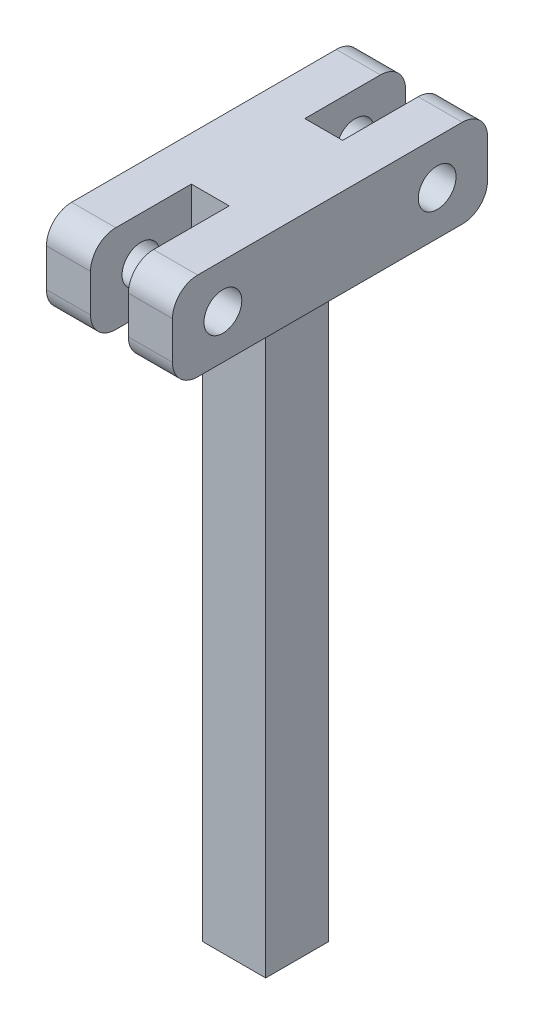
ISO-10303-21;
HEADER;
FILE_DESCRIPTION(('STEP AP214'),'2;1');
FILE_NAME('part.step','',(''),(''),'','','');
FILE_SCHEMA(('AUTOMOTIVE_DESIGN { 1 0 10303 214 1 1 1 1 }'));
ENDSEC;
DATA;
#1=APPLICATION_CONTEXT('core data for automotive mechanical design processes');
#2=APPLICATION_PROTOCOL_DEFINITION('international standard','automotive_design',2000,#1);
#3=PRODUCT_CONTEXT('',#1,'mechanical');
#4=PRODUCT('Part','Part','',(#3));
#5=PRODUCT_RELATED_PRODUCT_CATEGORY('part','',(#4));
#6=PRODUCT_DEFINITION_FORMATION('','',#4);
#7=PRODUCT_DEFINITION_CONTEXT('part definition',#1,'design');
#8=PRODUCT_DEFINITION('design','',#6,#7);
#9=PRODUCT_DEFINITION_SHAPE('','',#8);
#10=(LENGTH_UNIT() NAMED_UNIT(*) SI_UNIT(.MILLI.,.METRE.));
#11=(NAMED_UNIT(*) PLANE_ANGLE_UNIT() SI_UNIT($,.RADIAN.));
#12=(NAMED_UNIT(*) SI_UNIT($,.STERADIAN.) SOLID_ANGLE_UNIT());
#13=UNCERTAINTY_MEASURE_WITH_UNIT(LENGTH_MEASURE(1.E-05),#10,'distance_accuracy_value','');
#14=(GEOMETRIC_REPRESENTATION_CONTEXT(3) GLOBAL_UNCERTAINTY_ASSIGNED_CONTEXT((#13)) GLOBAL_UNIT_ASSIGNED_CONTEXT((#10,
#11,#12)) REPRESENTATION_CONTEXT('',''));
#15=CARTESIAN_POINT('',(0.,0.,0.));
#16=DIRECTION('',(0.,0.,1.));
#17=DIRECTION('',(1.,0.,0.));
#18=AXIS2_PLACEMENT_3D('',#15,#16,#17);
#19=CARTESIAN_POINT('',(5.,1.5,10.5));
#20=DIRECTION('',(-1.,0.,0.));
#21=DIRECTION('',(0.,0.,1.));
#22=AXIS2_PLACEMENT_3D('',#19,#20,#21);
#23=CYLINDRICAL_SURFACE('',#22,2.);
#24=DIRECTION('',(-1.,0.,0.));
#25=VECTOR('',#24,1.);
#26=CARTESIAN_POINT('',(5.,3.5,10.5));
#27=LINE('',#26,#25);
#28=CARTESIAN_POINT('',(5.,3.5,10.5));
#29=VERTEX_POINT('',#28);
#30=CARTESIAN_POINT('',(1.5,3.5,10.5));
#31=VERTEX_POINT('',#30);
#32=EDGE_CURVE('E364',#29,#31,#27,.T.);
#33=ORIENTED_EDGE('',*,*,#32,.T.);
#34=CARTESIAN_POINT('',(1.5,1.5,10.5));
#35=DIRECTION('',(1.,0.,0.));
#36=DIRECTION('',(0.,0.,-1.));
#37=AXIS2_PLACEMENT_3D('',#34,#35,#36);
#38=CIRCLE('',#37,2.);
#39=CARTESIAN_POINT('',(1.5,1.49999999999998,12.5));
#40=VERTEX_POINT('',#39);
#41=EDGE_CURVE('E277',#31,#40,#38,.T.);
#42=ORIENTED_EDGE('',*,*,#41,.T.);
#43=DIRECTION('',(-1.,0.,0.));
#44=VECTOR('',#43,1.);
#45=CARTESIAN_POINT('',(5.,1.5,12.5));
#46=LINE('',#45,#44);
#47=CARTESIAN_POINT('',(5.,1.5,12.5));
#48=VERTEX_POINT('',#47);
#49=EDGE_CURVE('E398',#48,#40,#46,.T.);
#50=ORIENTED_EDGE('',*,*,#49,.F.);
#51=CARTESIAN_POINT('',(5.,1.5,10.5));
#52=DIRECTION('',(1.,0.,0.));
#53=DIRECTION('',(0.,0.,1.));
#54=AXIS2_PLACEMENT_3D('',#51,#52,#53);
#55=CIRCLE('',#54,2.);
#56=EDGE_CURVE('E308',#29,#48,#55,.T.);
#57=ORIENTED_EDGE('',*,*,#56,.F.);
#58=EDGE_LOOP('',(#33,#42,#50,#57));
#59=FACE_BOUND('',#58,.T.);
#60=ADVANCED_FACE('F41',(#59),#23,.T.);
#61=CARTESIAN_POINT('',(5.,-1.5,12.5));
#62=DIRECTION('',(0.,0.,-1.));
#63=DIRECTION('',(-1.,0.,0.));
#64=AXIS2_PLACEMENT_3D('',#61,#62,#63);
#65=PLANE('',#64);
#66=ORIENTED_EDGE('',*,*,#49,.T.);
#67=DIRECTION('',(0.,1.,0.));
#68=VECTOR('',#67,1.);
#69=CARTESIAN_POINT('',(1.5,-50.,12.5));
#70=LINE('',#69,#68);
#71=CARTESIAN_POINT('',(1.5,-1.50000000000002,12.5));
#72=VERTEX_POINT('',#71);
#73=EDGE_CURVE('E477',#72,#40,#70,.T.);
#74=ORIENTED_EDGE('',*,*,#73,.F.);
#75=DIRECTION('',(-1.,0.,0.));
#76=VECTOR('',#75,1.);
#77=CARTESIAN_POINT('',(5.,-1.5,12.5));
#78=LINE('',#77,#76);
#79=CARTESIAN_POINT('',(5.,-1.5,12.5));
#80=VERTEX_POINT('',#79);
#81=EDGE_CURVE('E393',#80,#72,#78,.T.);
#82=ORIENTED_EDGE('',*,*,#81,.F.);
#83=DIRECTION('',(0.,-1.,0.));
#84=VECTOR('',#83,1.);
#85=CARTESIAN_POINT('',(5.,-1.5,12.5));
#86=LINE('',#85,#84);
#87=EDGE_CURVE('E312',#48,#80,#86,.T.);
#88=ORIENTED_EDGE('',*,*,#87,.F.);
#89=EDGE_LOOP('',(#66,#74,#82,#88));
#90=FACE_BOUND('',#89,.T.);
#91=ADVANCED_FACE('F531',(#90),#65,.F.);
#92=CARTESIAN_POINT('',(5.,-1.5,10.5));
#93=DIRECTION('',(-1.,0.,0.));
#94=DIRECTION('',(0.,0.,1.));
#95=AXIS2_PLACEMENT_3D('',#92,#93,#94);
#96=CYLINDRICAL_SURFACE('',#95,2.);
#97=ORIENTED_EDGE('',*,*,#81,.T.);
#98=CARTESIAN_POINT('',(1.5,-1.5,10.5));
#99=DIRECTION('',(1.,0.,0.));
#100=DIRECTION('',(0.,0.,-1.));
#101=AXIS2_PLACEMENT_3D('',#98,#99,#100);
#102=CIRCLE('',#101,2.);
#103=CARTESIAN_POINT('',(1.5,-3.5,10.5));
#104=VERTEX_POINT('',#103);
#105=EDGE_CURVE('E285',#72,#104,#102,.T.);
#106=ORIENTED_EDGE('',*,*,#105,.T.);
#107=DIRECTION('',(-1.,0.,0.));
#108=VECTOR('',#107,1.);
#109=CARTESIAN_POINT('',(5.,-3.5,10.5));
#110=LINE('',#109,#108);
#111=CARTESIAN_POINT('',(5.,-3.5,10.5));
#112=VERTEX_POINT('',#111);
#113=EDGE_CURVE('E388',#112,#104,#110,.T.);
#114=ORIENTED_EDGE('',*,*,#113,.F.);
#115=CARTESIAN_POINT('',(5.,-1.5,10.5));
#116=DIRECTION('',(1.,0.,0.));
#117=DIRECTION('',(0.,0.,-1.));
#118=AXIS2_PLACEMENT_3D('',#115,#116,#117);
#119=CIRCLE('',#118,2.);
#120=EDGE_CURVE('E316',#80,#112,#119,.T.);
#121=ORIENTED_EDGE('',*,*,#120,.F.);
#122=EDGE_LOOP('',(#97,#106,#114,#121));
#123=FACE_BOUND('',#122,.T.);
#124=ADVANCED_FACE('F524',(#123),#96,.T.);
#125=CARTESIAN_POINT('',(5.,-1.5,-10.5));
#126=DIRECTION('',(-1.,0.,0.));
#127=DIRECTION('',(0.,0.,1.));
#128=AXIS2_PLACEMENT_3D('',#125,#126,#127);
#129=CYLINDRICAL_SURFACE('',#128,2.);
#130=DIRECTION('',(-1.,0.,0.));
#131=VECTOR('',#130,1.);
#132=CARTESIAN_POINT('',(5.,-3.5,-10.5));
#133=LINE('',#132,#131);
#134=CARTESIAN_POINT('',(5.,-3.5,-10.5));
#135=VERTEX_POINT('',#134);
#136=CARTESIAN_POINT('',(1.5,-3.5,-10.5));
#137=VERTEX_POINT('',#136);
#138=EDGE_CURVE('E383',#135,#137,#133,.T.);
#139=ORIENTED_EDGE('',*,*,#138,.T.);
#140=CARTESIAN_POINT('',(1.5,-1.5,-10.5));
#141=DIRECTION('',(1.,0.,0.));
#142=DIRECTION('',(0.,0.,-1.));
#143=AXIS2_PLACEMENT_3D('',#140,#141,#142);
#144=CIRCLE('',#143,2.);
#145=CARTESIAN_POINT('',(1.5,-1.50000000000002,-12.5));
#146=VERTEX_POINT('',#145);
#147=EDGE_CURVE('E248',#137,#146,#144,.T.);
#148=ORIENTED_EDGE('',*,*,#147,.T.);
#149=DIRECTION('',(-1.,0.,0.));
#150=VECTOR('',#149,1.);
#151=CARTESIAN_POINT('',(5.,-1.5,-12.5));
#152=LINE('',#151,#150);
#153=CARTESIAN_POINT('',(5.,-1.5,-12.5));
#154=VERTEX_POINT('',#153);
#155=EDGE_CURVE('E379',#154,#146,#152,.T.);
#156=ORIENTED_EDGE('',*,*,#155,.F.);
#157=CARTESIAN_POINT('',(5.,-1.5,-10.5));
#158=DIRECTION('',(1.,0.,0.));
#159=DIRECTION('',(0.,0.,1.));
#160=AXIS2_PLACEMENT_3D('',#157,#158,#159);
#161=CIRCLE('',#160,2.);
#162=EDGE_CURVE('E322',#135,#154,#161,.T.);
#163=ORIENTED_EDGE('',*,*,#162,.F.);
#164=EDGE_LOOP('',(#139,#148,#156,#163));
#165=FACE_BOUND('',#164,.T.);
#166=ADVANCED_FACE('F533',(#165),#129,.T.);
#167=CARTESIAN_POINT('',(5.,-1.5,-12.5));
#168=DIRECTION('',(0.,0.,1.));
#169=DIRECTION('',(1.,0.,0.));
#170=AXIS2_PLACEMENT_3D('',#167,#168,#169);
#171=PLANE('',#170);
#172=ORIENTED_EDGE('',*,*,#155,.T.);
#173=DIRECTION('',(0.,1.,0.));
#174=VECTOR('',#173,1.);
#175=CARTESIAN_POINT('',(1.5,-50.,-12.5));
#176=LINE('',#175,#174);
#177=CARTESIAN_POINT('',(1.5,1.49999999999999,-12.5));
#178=VERTEX_POINT('',#177);
#179=EDGE_CURVE('E583',#146,#178,#176,.T.);
#180=ORIENTED_EDGE('',*,*,#179,.T.);
#181=DIRECTION('',(-1.,0.,0.));
#182=VECTOR('',#181,1.);
#183=CARTESIAN_POINT('',(5.,1.5,-12.5));
#184=LINE('',#183,#182);
#185=CARTESIAN_POINT('',(5.,1.5,-12.5));
#186=VERTEX_POINT('',#185);
#187=EDGE_CURVE('E374',#186,#178,#184,.T.);
#188=ORIENTED_EDGE('',*,*,#187,.F.);
#189=DIRECTION('',(0.,1.,0.));
#190=VECTOR('',#189,1.);
#191=CARTESIAN_POINT('',(5.,-1.5,-12.5));
#192=LINE('',#191,#190);
#193=EDGE_CURVE('E325',#154,#186,#192,.T.);
#194=ORIENTED_EDGE('',*,*,#193,.F.);
#195=EDGE_LOOP('',(#172,#180,#188,#194));
#196=FACE_BOUND('',#195,.T.);
#197=ADVANCED_FACE('F566',(#196),#171,.F.);
#198=CARTESIAN_POINT('',(5.,1.5,-10.5));
#199=DIRECTION('',(-1.,0.,0.));
#200=DIRECTION('',(0.,0.,1.));
#201=AXIS2_PLACEMENT_3D('',#198,#199,#200);
#202=CYLINDRICAL_SURFACE('',#201,2.);
#203=ORIENTED_EDGE('',*,*,#187,.T.);
#204=CARTESIAN_POINT('',(1.5,1.5,-10.5));
#205=DIRECTION('',(1.,0.,0.));
#206=DIRECTION('',(0.,0.,-1.));
#207=AXIS2_PLACEMENT_3D('',#204,#205,#206);
#208=CIRCLE('',#207,2.);
#209=CARTESIAN_POINT('',(1.5,3.5,-10.5));
#210=VERTEX_POINT('',#209);
#211=EDGE_CURVE('E244',#178,#210,#208,.T.);
#212=ORIENTED_EDGE('',*,*,#211,.T.);
#213=DIRECTION('',(-1.,0.,0.));
#214=VECTOR('',#213,1.);
#215=CARTESIAN_POINT('',(5.,3.5,-10.5));
#216=LINE('',#215,#214);
#217=CARTESIAN_POINT('',(5.,3.5,-10.5));
#218=VERTEX_POINT('',#217);
#219=EDGE_CURVE('E369',#218,#210,#216,.T.);
#220=ORIENTED_EDGE('',*,*,#219,.F.);
#221=CARTESIAN_POINT('',(5.,1.5,-10.5));
#222=DIRECTION('',(1.,0.,0.));
#223=DIRECTION('',(0.,0.,1.));
#224=AXIS2_PLACEMENT_3D('',#221,#222,#223);
#225=CIRCLE('',#224,2.);
#226=EDGE_CURVE('E328',#186,#218,#225,.T.);
#227=ORIENTED_EDGE('',*,*,#226,.F.);
#228=EDGE_LOOP('',(#203,#212,#220,#227));
#229=FACE_BOUND('',#228,.T.);
#230=ADVANCED_FACE('F563',(#229),#202,.T.);
#231=CARTESIAN_POINT('',(5.,0.,8.5));
#232=DIRECTION('',(-1.,0.,0.));
#233=DIRECTION('',(0.,0.,1.));
#234=AXIS2_PLACEMENT_3D('',#231,#232,#233);
#235=CYLINDRICAL_SURFACE('',#234,1.5);
#236=CARTESIAN_POINT('',(1.5,0.,8.5));
#237=DIRECTION('',(1.,0.,0.));
#238=DIRECTION('',(0.,0.,-1.));
#239=AXIS2_PLACEMENT_3D('',#236,#237,#238);
#240=CIRCLE('',#239,1.5);
#241=CARTESIAN_POINT('',(1.5,0.,7.));
#242=VERTEX_POINT('',#241);
#243=EDGE_CURVE('E272',#242,#242,#240,.T.);
#244=ORIENTED_EDGE('',*,*,#243,.F.);
#245=EDGE_LOOP('',(#244));
#246=FACE_BOUND('',#245,.T.);
#247=CARTESIAN_POINT('',(5.,0.,8.5));
#248=DIRECTION('',(1.,0.,0.));
#249=DIRECTION('',(0.,0.,-1.));
#250=AXIS2_PLACEMENT_3D('',#247,#248,#249);
#251=CIRCLE('',#250,1.5);
#252=CARTESIAN_POINT('',(5.,0.,7.));
#253=VERTEX_POINT('',#252);
#254=EDGE_CURVE('E300',#253,#253,#251,.T.);
#255=ORIENTED_EDGE('',*,*,#254,.T.);
#256=EDGE_LOOP('',(#255));
#257=FACE_BOUND('',#256,.T.);
#258=ADVANCED_FACE('F607',(#246,#257),#235,.F.);
#259=CARTESIAN_POINT('',(5.,0.,-8.49999999999999));
#260=DIRECTION('',(-1.,0.,0.));
#261=DIRECTION('',(0.,0.,1.));
#262=AXIS2_PLACEMENT_3D('',#259,#260,#261);
#263=CYLINDRICAL_SURFACE('',#262,1.5);
#264=CARTESIAN_POINT('',(1.5,0.,-8.49999999999999));
#265=DIRECTION('',(1.,0.,0.));
#266=DIRECTION('',(0.,0.,-1.));
#267=AXIS2_PLACEMENT_3D('',#264,#265,#266);
#268=CIRCLE('',#267,1.5);
#269=CARTESIAN_POINT('',(1.5,0.,-9.99999999999999));
#270=VERTEX_POINT('',#269);
#271=EDGE_CURVE('E230',#270,#270,#268,.T.);
#272=ORIENTED_EDGE('',*,*,#271,.F.);
#273=EDGE_LOOP('',(#272));
#274=FACE_BOUND('',#273,.T.);
#275=CARTESIAN_POINT('',(5.,0.,-8.49999999999999));
#276=DIRECTION('',(1.,0.,0.));
#277=DIRECTION('',(0.,0.,-1.));
#278=AXIS2_PLACEMENT_3D('',#275,#276,#277);
#279=CIRCLE('',#278,1.5);
#280=CARTESIAN_POINT('',(5.,0.,-9.99999999999999));
#281=VERTEX_POINT('',#280);
#282=EDGE_CURVE('E292',#281,#281,#279,.T.);
#283=ORIENTED_EDGE('',*,*,#282,.T.);
#284=EDGE_LOOP('',(#283));
#285=FACE_BOUND('',#284,.T.);
#286=ADVANCED_FACE('F553',(#274,#285),#263,.F.);
#287=CARTESIAN_POINT('',(5.,1.5,10.5));
#288=DIRECTION('',(-1.,0.,0.));
#289=DIRECTION('',(0.,0.,1.));
#290=AXIS2_PLACEMENT_3D('',#287,#288,#289);
#291=PLANE('',#290);
#292=ORIENTED_EDGE('',*,*,#56,.T.);
#293=ORIENTED_EDGE('',*,*,#87,.T.);
#294=ORIENTED_EDGE('',*,*,#120,.T.);
#295=DIRECTION('',(0.,0.,-1.));
#296=VECTOR('',#295,1.);
#297=CARTESIAN_POINT('',(5.,-3.5,-10.5));
#298=LINE('',#297,#296);
#299=EDGE_CURVE('E319',#112,#135,#298,.T.);
#300=ORIENTED_EDGE('',*,*,#299,.T.);
#301=ORIENTED_EDGE('',*,*,#162,.T.);
#302=ORIENTED_EDGE('',*,*,#193,.T.);
#303=ORIENTED_EDGE('',*,*,#226,.T.);
#304=DIRECTION('',(0.,0.,1.));
#305=VECTOR('',#304,1.);
#306=CARTESIAN_POINT('',(5.,3.5,-10.5));
#307=LINE('',#306,#305);
#308=EDGE_CURVE('E331',#218,#29,#307,.T.);
#309=ORIENTED_EDGE('',*,*,#308,.T.);
#310=EDGE_LOOP('',(#292,#293,#294,#300,#301,#302,#303,#309));
#311=FACE_BOUND('',#310,.T.);
#312=ORIENTED_EDGE('',*,*,#254,.F.);
#313=EDGE_LOOP('',(#312));
#314=FACE_BOUND('',#313,.T.);
#315=ORIENTED_EDGE('',*,*,#282,.F.);
#316=EDGE_LOOP('',(#315));
#317=FACE_BOUND('',#316,.T.);
#318=ADVANCED_FACE('F547',(#311,#314,#317),#291,.F.);
#319=CARTESIAN_POINT('',(-5.,1.5,10.5));
#320=DIRECTION('',(-1.,0.,0.));
#321=DIRECTION('',(0.,0.,1.));
#322=AXIS2_PLACEMENT_3D('',#319,#320,#321);
#323=PLANE('',#322);
#324=CARTESIAN_POINT('',(-5.,0.,8.5));
#325=DIRECTION('',(1.,0.,0.));
#326=DIRECTION('',(0.,0.,-1.));
#327=AXIS2_PLACEMENT_3D('',#324,#325,#326);
#328=CIRCLE('',#327,1.5);
#329=CARTESIAN_POINT('',(-5.,0.,7.));
#330=VERTEX_POINT('',#329);
#331=EDGE_CURVE('E296',#330,#330,#328,.T.);
#332=ORIENTED_EDGE('',*,*,#331,.T.);
#333=EDGE_LOOP('',(#332));
#334=FACE_BOUND('',#333,.T.);
#335=CARTESIAN_POINT('',(-5.,1.5,10.5));
#336=DIRECTION('',(1.,0.,0.));
#337=DIRECTION('',(0.,0.,1.));
#338=AXIS2_PLACEMENT_3D('',#335,#336,#337);
#339=CIRCLE('',#338,2.);
#340=CARTESIAN_POINT('',(-5.,3.5,10.5));
#341=VERTEX_POINT('',#340);
#342=CARTESIAN_POINT('',(-5.,1.5,12.5));
#343=VERTEX_POINT('',#342);
#344=EDGE_CURVE('E304',#341,#343,#339,.T.);
#345=ORIENTED_EDGE('',*,*,#344,.F.);
#346=DIRECTION('',(0.,0.,1.));
#347=VECTOR('',#346,1.);
#348=CARTESIAN_POINT('',(-5.,3.5,-10.5));
#349=LINE('',#348,#347);
#350=CARTESIAN_POINT('',(-5.,3.5,-10.5));
#351=VERTEX_POINT('',#350);
#352=EDGE_CURVE('E313',#351,#341,#349,.T.);
#353=ORIENTED_EDGE('',*,*,#352,.F.);
#354=CARTESIAN_POINT('',(-5.,1.5,-10.5));
#355=DIRECTION('',(1.,0.,0.));
#356=DIRECTION('',(0.,0.,1.));
#357=AXIS2_PLACEMENT_3D('',#354,#355,#356);
#358=CIRCLE('',#357,2.);
#359=CARTESIAN_POINT('',(-5.,1.5,-12.5));
#360=VERTEX_POINT('',#359);
#361=EDGE_CURVE('E357',#360,#351,#358,.T.);
#362=ORIENTED_EDGE('',*,*,#361,.F.);
#363=DIRECTION('',(0.,1.,0.));
#364=VECTOR('',#363,1.);
#365=CARTESIAN_POINT('',(-5.,-1.5,-12.5));
#366=LINE('',#365,#364);
#367=CARTESIAN_POINT('',(-5.,-1.5,-12.5));
#368=VERTEX_POINT('',#367);
#369=EDGE_CURVE('E353',#368,#360,#366,.T.);
#370=ORIENTED_EDGE('',*,*,#369,.F.);
#371=CARTESIAN_POINT('',(-5.,-1.5,-10.5));
#372=DIRECTION('',(1.,0.,0.));
#373=DIRECTION('',(0.,0.,1.));
#374=AXIS2_PLACEMENT_3D('',#371,#372,#373);
#375=CIRCLE('',#374,2.);
#376=CARTESIAN_POINT('',(-5.,-3.5,-10.5));
#377=VERTEX_POINT('',#376);
#378=EDGE_CURVE('E349',#377,#368,#375,.T.);
#379=ORIENTED_EDGE('',*,*,#378,.F.);
#380=DIRECTION('',(0.,0.,-1.));
#381=VECTOR('',#380,1.);
#382=CARTESIAN_POINT('',(-5.,-3.5,-10.5));
#383=LINE('',#382,#381);
#384=CARTESIAN_POINT('',(-5.,-3.5,10.5));
#385=VERTEX_POINT('',#384);
#386=EDGE_CURVE('E346',#385,#377,#383,.T.);
#387=ORIENTED_EDGE('',*,*,#386,.F.);
#388=CARTESIAN_POINT('',(-5.,-1.5,10.5));
#389=DIRECTION('',(1.,0.,0.));
#390=DIRECTION('',(0.,0.,-1.));
#391=AXIS2_PLACEMENT_3D('',#388,#389,#390);
#392=CIRCLE('',#391,2.);
#393=CARTESIAN_POINT('',(-5.,-1.5,12.5));
#394=VERTEX_POINT('',#393);
#395=EDGE_CURVE('E342',#394,#385,#392,.T.);
#396=ORIENTED_EDGE('',*,*,#395,.F.);
#397=DIRECTION('',(0.,-1.,0.));
#398=VECTOR('',#397,1.);
#399=CARTESIAN_POINT('',(-5.,-1.5,12.5));
#400=LINE('',#399,#398);
#401=EDGE_CURVE('E338',#343,#394,#400,.T.);
#402=ORIENTED_EDGE('',*,*,#401,.F.);
#403=EDGE_LOOP('',(#345,#353,#362,#370,#379,#387,#396,#402));
#404=FACE_BOUND('',#403,.T.);
#405=CARTESIAN_POINT('',(-5.,0.,-8.49999999999999));
#406=DIRECTION('',(1.,0.,0.));
#407=DIRECTION('',(0.,0.,-1.));
#408=AXIS2_PLACEMENT_3D('',#405,#406,#407);
#409=CIRCLE('',#408,1.5);
#410=CARTESIAN_POINT('',(-5.,0.,-9.99999999999999));
#411=VERTEX_POINT('',#410);
#412=EDGE_CURVE('E214',#411,#411,#409,.T.);
#413=ORIENTED_EDGE('',*,*,#412,.T.);
#414=EDGE_LOOP('',(#413));
#415=FACE_BOUND('',#414,.T.);
#416=ADVANCED_FACE('F505',(#334,#404,#415),#323,.T.);
#417=CARTESIAN_POINT('',(-1.5,1.49999999999998,12.5));
#418=VERTEX_POINT('',#417);
#419=EDGE_CURVE('E397',#418,#343,#46,.T.);
#420=ORIENTED_EDGE('',*,*,#419,.F.);
#421=CARTESIAN_POINT('',(-1.5,1.5,10.5));
#422=DIRECTION('',(-1.,0.,0.));
#423=DIRECTION('',(0.,0.,1.));
#424=AXIS2_PLACEMENT_3D('',#421,#422,#423);
#425=CIRCLE('',#424,2.);
#426=CARTESIAN_POINT('',(-1.5,3.5,10.5));
#427=VERTEX_POINT('',#426);
#428=EDGE_CURVE('E260',#418,#427,#425,.T.);
#429=ORIENTED_EDGE('',*,*,#428,.T.);
#430=EDGE_CURVE('E334',#427,#341,#27,.T.);
#431=ORIENTED_EDGE('',*,*,#430,.T.);
#432=ORIENTED_EDGE('',*,*,#344,.T.);
#433=EDGE_LOOP('',(#420,#429,#431,#432));
#434=FACE_BOUND('',#433,.T.);
#435=ADVANCED_FACE('F500',(#434),#23,.T.);
#436=CARTESIAN_POINT('',(-1.5,-1.5,12.5));
#437=VERTEX_POINT('',#436);
#438=EDGE_CURVE('E392',#437,#394,#78,.T.);
#439=ORIENTED_EDGE('',*,*,#438,.F.);
#440=DIRECTION('',(0.,1.,0.));
#441=VECTOR('',#440,1.);
#442=CARTESIAN_POINT('',(-1.5,-50.,12.5));
#443=LINE('',#442,#441);
#444=EDGE_CURVE('E472',#437,#418,#443,.T.);
#445=ORIENTED_EDGE('',*,*,#444,.T.);
#446=ORIENTED_EDGE('',*,*,#419,.T.);
#447=ORIENTED_EDGE('',*,*,#401,.T.);
#448=EDGE_LOOP('',(#439,#445,#446,#447));
#449=FACE_BOUND('',#448,.T.);
#450=ADVANCED_FACE('F511',(#449),#65,.F.);
#451=CARTESIAN_POINT('',(-1.5,-3.5,10.5));
#452=VERTEX_POINT('',#451);
#453=EDGE_CURVE('E387',#452,#385,#110,.T.);
#454=ORIENTED_EDGE('',*,*,#453,.F.);
#455=CARTESIAN_POINT('',(-1.5,-1.5,10.5));
#456=DIRECTION('',(-1.,0.,0.));
#457=DIRECTION('',(0.,0.,1.));
#458=AXIS2_PLACEMENT_3D('',#455,#456,#457);
#459=CIRCLE('',#458,2.);
#460=EDGE_CURVE('E268',#452,#437,#459,.T.);
#461=ORIENTED_EDGE('',*,*,#460,.T.);
#462=ORIENTED_EDGE('',*,*,#438,.T.);
#463=ORIENTED_EDGE('',*,*,#395,.T.);
#464=EDGE_LOOP('',(#454,#461,#462,#463));
#465=FACE_BOUND('',#464,.T.);
#466=ADVANCED_FACE('F521',(#465),#96,.T.);
#467=CARTESIAN_POINT('',(5.,-3.5,-10.5));
#468=DIRECTION('',(0.,1.,0.));
#469=DIRECTION('',(0.,0.,1.));
#470=AXIS2_PLACEMENT_3D('',#467,#468,#469);
#471=PLANE('',#470);
#472=DIRECTION('',(1.,0.,0.));
#473=VECTOR('',#472,1.);
#474=CARTESIAN_POINT('',(5.,-3.5,-4.5));
#475=LINE('',#474,#473);
#476=CARTESIAN_POINT('',(-1.5,-3.50000000000002,-4.5));
#477=VERTEX_POINT('',#476);
#478=CARTESIAN_POINT('',(1.5,-3.50000000000002,-4.5));
#479=VERTEX_POINT('',#478);
#480=EDGE_CURVE('E204',#477,#479,#475,.T.);
#481=ORIENTED_EDGE('',*,*,#480,.T.);
#482=DIRECTION('',(0.,0.,-1.));
#483=VECTOR('',#482,1.);
#484=CARTESIAN_POINT('',(1.5,-3.5,-10.5));
#485=LINE('',#484,#483);
#486=EDGE_CURVE('E252',#479,#137,#485,.T.);
#487=ORIENTED_EDGE('',*,*,#486,.T.);
#488=ORIENTED_EDGE('',*,*,#138,.F.);
#489=ORIENTED_EDGE('',*,*,#299,.F.);
#490=ORIENTED_EDGE('',*,*,#113,.T.);
#491=DIRECTION('',(0.,0.,-1.));
#492=VECTOR('',#491,1.);
#493=CARTESIAN_POINT('',(1.5,-3.5,-10.5));
#494=LINE('',#493,#492);
#495=CARTESIAN_POINT('',(1.5,-3.50000000000002,4.5));
#496=VERTEX_POINT('',#495);
#497=EDGE_CURVE('E281',#104,#496,#494,.T.);
#498=ORIENTED_EDGE('',*,*,#497,.T.);
#499=DIRECTION('',(-1.,0.,0.));
#500=VECTOR('',#499,1.);
#501=CARTESIAN_POINT('',(5.,-3.5,4.5));
#502=LINE('',#501,#500);
#503=CARTESIAN_POINT('',(-1.5,-3.50000000000002,4.5));
#504=VERTEX_POINT('',#503);
#505=EDGE_CURVE('E215',#496,#504,#502,.T.);
#506=ORIENTED_EDGE('',*,*,#505,.T.);
#507=DIRECTION('',(0.,0.,1.));
#508=VECTOR('',#507,1.);
#509=CARTESIAN_POINT('',(-1.5,-3.5,-10.5));
#510=LINE('',#509,#508);
#511=EDGE_CURVE('E264',#504,#452,#510,.T.);
#512=ORIENTED_EDGE('',*,*,#511,.T.);
#513=ORIENTED_EDGE('',*,*,#453,.T.);
#514=ORIENTED_EDGE('',*,*,#386,.T.);
#515=CARTESIAN_POINT('',(-1.5,-3.5,-10.5));
#516=VERTEX_POINT('',#515);
#517=EDGE_CURVE('E228',#516,#377,#133,.T.);
#518=ORIENTED_EDGE('',*,*,#517,.F.);
#519=DIRECTION('',(0.,0.,1.));
#520=VECTOR('',#519,1.);
#521=CARTESIAN_POINT('',(-1.5,-3.5,-10.5));
#522=LINE('',#521,#520);
#523=EDGE_CURVE('E218',#516,#477,#522,.T.);
#524=ORIENTED_EDGE('',*,*,#523,.T.);
#525=EDGE_LOOP('',(#481,#487,#488,#489,#490,#498,#506,#512,#513,#514,#518,#524));
#526=FACE_BOUND('',#525,.T.);
#527=DIRECTION('',(0.,0.,-1.));
#528=VECTOR('',#527,1.);
#529=CARTESIAN_POINT('',(-2.5,-3.5,2.60488586053399));
#530=LINE('',#529,#528);
#531=CARTESIAN_POINT('',(-2.5,-3.5,2.60488586053398));
#532=VERTEX_POINT('',#531);
#533=CARTESIAN_POINT('',(-2.5,-3.5,-2.39511413946602));
#534=VERTEX_POINT('',#533);
#535=EDGE_CURVE('E410',#532,#534,#530,.T.);
#536=ORIENTED_EDGE('',*,*,#535,.F.);
#537=DIRECTION('',(-1.,0.,0.));
#538=VECTOR('',#537,1.);
#539=CARTESIAN_POINT('',(2.5,-3.5,2.60488586053398));
#540=LINE('',#539,#538);
#541=CARTESIAN_POINT('',(2.5,-3.5,2.60488586053398));
#542=VERTEX_POINT('',#541);
#543=EDGE_CURVE('E435',#542,#532,#540,.T.);
#544=ORIENTED_EDGE('',*,*,#543,.F.);
#545=DIRECTION('',(0.,0.,1.));
#546=VECTOR('',#545,1.);
#547=CARTESIAN_POINT('',(2.5,-3.5,2.60488586053399));
#548=LINE('',#547,#546);
#549=CARTESIAN_POINT('',(2.5,-3.5,-2.39511413946602));
#550=VERTEX_POINT('',#549);
#551=EDGE_CURVE('E402',#550,#542,#548,.T.);
#552=ORIENTED_EDGE('',*,*,#551,.F.);
#553=DIRECTION('',(1.,0.,0.));
#554=VECTOR('',#553,1.);
#555=CARTESIAN_POINT('',(2.5,-3.5,-2.39511413946602));
#556=LINE('',#555,#554);
#557=EDGE_CURVE('E406',#534,#550,#556,.T.);
#558=ORIENTED_EDGE('',*,*,#557,.F.);
#559=EDGE_LOOP('',(#536,#544,#552,#558));
#560=FACE_BOUND('',#559,.T.);
#561=ADVANCED_FACE('F225',(#526,#560),#471,.F.);
#562=CARTESIAN_POINT('',(-1.5,-1.50000000000002,-12.5));
#563=VERTEX_POINT('',#562);
#564=EDGE_CURVE('E378',#563,#368,#152,.T.);
#565=ORIENTED_EDGE('',*,*,#564,.F.);
#566=CARTESIAN_POINT('',(-1.5,-1.5,-10.5));
#567=DIRECTION('',(-1.,0.,0.));
#568=DIRECTION('',(0.,0.,1.));
#569=AXIS2_PLACEMENT_3D('',#566,#567,#568);
#570=CIRCLE('',#569,2.);
#571=EDGE_CURVE('E231',#563,#516,#570,.T.);
#572=ORIENTED_EDGE('',*,*,#571,.T.);
#573=ORIENTED_EDGE('',*,*,#517,.T.);
#574=ORIENTED_EDGE('',*,*,#378,.T.);
#575=EDGE_LOOP('',(#565,#572,#573,#574));
#576=FACE_BOUND('',#575,.T.);
#577=ADVANCED_FACE('F518',(#576),#129,.T.);
#578=CARTESIAN_POINT('',(-1.5,1.49999999999999,-12.5));
#579=VERTEX_POINT('',#578);
#580=EDGE_CURVE('E373',#579,#360,#184,.T.);
#581=ORIENTED_EDGE('',*,*,#580,.F.);
#582=DIRECTION('',(0.,1.,0.));
#583=VECTOR('',#582,1.);
#584=CARTESIAN_POINT('',(-1.5,-50.,-12.5));
#585=LINE('',#584,#583);
#586=EDGE_CURVE('E222',#563,#579,#585,.T.);
#587=ORIENTED_EDGE('',*,*,#586,.F.);
#588=ORIENTED_EDGE('',*,*,#564,.T.);
#589=ORIENTED_EDGE('',*,*,#369,.T.);
#590=EDGE_LOOP('',(#581,#587,#588,#589));
#591=FACE_BOUND('',#590,.T.);
#592=ADVANCED_FACE('F490',(#591),#171,.F.);
#593=CARTESIAN_POINT('',(-1.5,3.5,-10.5));
#594=VERTEX_POINT('',#593);
#595=EDGE_CURVE('E368',#594,#351,#216,.T.);
#596=ORIENTED_EDGE('',*,*,#595,.F.);
#597=CARTESIAN_POINT('',(-1.5,1.5,-10.5));
#598=DIRECTION('',(-1.,0.,0.));
#599=DIRECTION('',(0.,0.,1.));
#600=AXIS2_PLACEMENT_3D('',#597,#598,#599);
#601=CIRCLE('',#600,2.);
#602=EDGE_CURVE('E65',#594,#579,#601,.T.);
#603=ORIENTED_EDGE('',*,*,#602,.T.);
#604=ORIENTED_EDGE('',*,*,#580,.T.);
#605=ORIENTED_EDGE('',*,*,#361,.T.);
#606=EDGE_LOOP('',(#596,#603,#604,#605));
#607=FACE_BOUND('',#606,.T.);
#608=ADVANCED_FACE('F487',(#607),#202,.T.);
#609=CARTESIAN_POINT('',(5.,3.5,-10.5));
#610=DIRECTION('',(0.,-1.,0.));
#611=DIRECTION('',(0.,0.,-1.));
#612=AXIS2_PLACEMENT_3D('',#609,#610,#611);
#613=PLANE('',#612);
#614=ORIENTED_EDGE('',*,*,#219,.T.);
#615=DIRECTION('',(0.,0.,1.));
#616=VECTOR('',#615,1.);
#617=CARTESIAN_POINT('',(1.5,3.5,-10.5));
#618=LINE('',#617,#616);
#619=CARTESIAN_POINT('',(1.5,3.49999999999999,-4.5));
#620=VERTEX_POINT('',#619);
#621=EDGE_CURVE('E236',#210,#620,#618,.T.);
#622=ORIENTED_EDGE('',*,*,#621,.T.);
#623=DIRECTION('',(-1.,0.,0.));
#624=VECTOR('',#623,1.);
#625=CARTESIAN_POINT('',(5.,3.5,-4.5));
#626=LINE('',#625,#624);
#627=CARTESIAN_POINT('',(-1.5,3.49999999999999,-4.5));
#628=VERTEX_POINT('',#627);
#629=EDGE_CURVE('E11',#620,#628,#626,.T.);
#630=ORIENTED_EDGE('',*,*,#629,.T.);
#631=DIRECTION('',(0.,0.,-1.));
#632=VECTOR('',#631,1.);
#633=CARTESIAN_POINT('',(-1.5,3.5,-10.5));
#634=LINE('',#633,#632);
#635=EDGE_CURVE('E220',#628,#594,#634,.T.);
#636=ORIENTED_EDGE('',*,*,#635,.T.);
#637=ORIENTED_EDGE('',*,*,#595,.T.);
#638=ORIENTED_EDGE('',*,*,#352,.T.);
#639=ORIENTED_EDGE('',*,*,#430,.F.);
#640=DIRECTION('',(0.,0.,-1.));
#641=VECTOR('',#640,1.);
#642=CARTESIAN_POINT('',(-1.5,3.5,-10.5));
#643=LINE('',#642,#641);
#644=CARTESIAN_POINT('',(-1.5,3.49999999999998,4.50000000000001));
#645=VERTEX_POINT('',#644);
#646=EDGE_CURVE('E256',#427,#645,#643,.T.);
#647=ORIENTED_EDGE('',*,*,#646,.T.);
#648=DIRECTION('',(1.,0.,0.));
#649=VECTOR('',#648,1.);
#650=CARTESIAN_POINT('',(5.,3.5,4.50000000000001));
#651=LINE('',#650,#649);
#652=CARTESIAN_POINT('',(1.5,3.5,4.50000000000001));
#653=VERTEX_POINT('',#652);
#654=EDGE_CURVE('E50',#645,#653,#651,.T.);
#655=ORIENTED_EDGE('',*,*,#654,.T.);
#656=DIRECTION('',(0.,0.,1.));
#657=VECTOR('',#656,1.);
#658=CARTESIAN_POINT('',(1.5,3.5,-10.5));
#659=LINE('',#658,#657);
#660=EDGE_CURVE('E273',#653,#31,#659,.T.);
#661=ORIENTED_EDGE('',*,*,#660,.T.);
#662=ORIENTED_EDGE('',*,*,#32,.F.);
#663=ORIENTED_EDGE('',*,*,#308,.F.);
#664=EDGE_LOOP('',(#614,#622,#630,#636,#637,#638,#639,#647,#655,#661,#662,#663));
#665=FACE_BOUND('',#664,.T.);
#666=ADVANCED_FACE('F462',(#665),#613,.F.);
#667=CARTESIAN_POINT('',(-1.5,0.,8.5));
#668=DIRECTION('',(-1.,0.,0.));
#669=DIRECTION('',(0.,0.,1.));
#670=AXIS2_PLACEMENT_3D('',#667,#668,#669);
#671=CIRCLE('',#670,1.5);
#672=CARTESIAN_POINT('',(-1.5,0.,10.));
#673=VERTEX_POINT('',#672);
#674=EDGE_CURVE('E255',#673,#673,#671,.T.);
#675=ORIENTED_EDGE('',*,*,#674,.F.);
#676=EDGE_LOOP('',(#675));
#677=FACE_BOUND('',#676,.T.);
#678=ORIENTED_EDGE('',*,*,#331,.F.);
#679=EDGE_LOOP('',(#678));
#680=FACE_BOUND('',#679,.T.);
#681=ADVANCED_FACE('F560',(#677,#680),#235,.F.);
#682=CARTESIAN_POINT('',(-1.5,0.,-8.49999999999999));
#683=DIRECTION('',(-1.,0.,0.));
#684=DIRECTION('',(0.,0.,1.));
#685=AXIS2_PLACEMENT_3D('',#682,#683,#684);
#686=CIRCLE('',#685,1.5);
#687=CARTESIAN_POINT('',(-1.5,0.,-7.));
#688=VERTEX_POINT('',#687);
#689=EDGE_CURVE('E450',#688,#688,#686,.T.);
#690=ORIENTED_EDGE('',*,*,#689,.F.);
#691=EDGE_LOOP('',(#690));
#692=FACE_BOUND('',#691,.T.);
#693=ORIENTED_EDGE('',*,*,#412,.F.);
#694=EDGE_LOOP('',(#693));
#695=FACE_BOUND('',#694,.T.);
#696=ADVANCED_FACE('F617',(#692,#695),#263,.F.);
#697=CARTESIAN_POINT('',(-2.5,-50.,2.60488586053398));
#698=DIRECTION('',(-1.,0.,0.));
#699=DIRECTION('',(0.,0.,1.));
#700=AXIS2_PLACEMENT_3D('',#697,#698,#699);
#701=PLANE('',#700);
#702=DIRECTION('',(0.,1.,0.));
#703=VECTOR('',#702,1.);
#704=CARTESIAN_POINT('',(-2.5,-50.,2.60488586053398));
#705=LINE('',#704,#703);
#706=CARTESIAN_POINT('',(-2.5,-50.,2.60488586053398));
#707=VERTEX_POINT('',#706);
#708=EDGE_CURVE('E430',#707,#532,#705,.T.);
#709=ORIENTED_EDGE('',*,*,#708,.T.);
#710=ORIENTED_EDGE('',*,*,#535,.T.);
#711=DIRECTION('',(0.,1.,0.));
#712=VECTOR('',#711,1.);
#713=CARTESIAN_POINT('',(-2.5,-50.,-2.39511413946602));
#714=LINE('',#713,#712);
#715=CARTESIAN_POINT('',(-2.5,-50.,-2.39511413946602));
#716=VERTEX_POINT('',#715);
#717=EDGE_CURVE('E431',#716,#534,#714,.T.);
#718=ORIENTED_EDGE('',*,*,#717,.F.);
#719=DIRECTION('',(0.,0.,1.));
#720=VECTOR('',#719,1.);
#721=CARTESIAN_POINT('',(-2.5,-50.,2.60488586053398));
#722=LINE('',#721,#720);
#723=EDGE_CURVE('E414',#716,#707,#722,.T.);
#724=ORIENTED_EDGE('',*,*,#723,.T.);
#725=EDGE_LOOP('',(#709,#710,#718,#724));
#726=FACE_BOUND('',#725,.T.);
#727=ADVANCED_FACE('F43',(#726),#701,.T.);
#728=CARTESIAN_POINT('',(2.5,-50.,-2.39511413946602));
#729=DIRECTION('',(0.,0.,-1.));
#730=DIRECTION('',(-1.,0.,0.));
#731=AXIS2_PLACEMENT_3D('',#728,#729,#730);
#732=PLANE('',#731);
#733=ORIENTED_EDGE('',*,*,#717,.T.);
#734=ORIENTED_EDGE('',*,*,#557,.T.);
#735=DIRECTION('',(0.,1.,0.));
#736=VECTOR('',#735,1.);
#737=CARTESIAN_POINT('',(2.5,-50.,-2.39511413946602));
#738=LINE('',#737,#736);
#739=CARTESIAN_POINT('',(2.5,-50.,-2.39511413946602));
#740=VERTEX_POINT('',#739);
#741=EDGE_CURVE('E436',#740,#550,#738,.T.);
#742=ORIENTED_EDGE('',*,*,#741,.F.);
#743=DIRECTION('',(-1.,0.,0.));
#744=VECTOR('',#743,1.);
#745=CARTESIAN_POINT('',(2.5,-50.,-2.39511413946602));
#746=LINE('',#745,#744);
#747=EDGE_CURVE('E426',#740,#716,#746,.T.);
#748=ORIENTED_EDGE('',*,*,#747,.T.);
#749=EDGE_LOOP('',(#733,#734,#742,#748));
#750=FACE_BOUND('',#749,.T.);
#751=ADVANCED_FACE('F664',(#750),#732,.T.);
#752=CARTESIAN_POINT('',(2.5,-50.,2.60488586053398));
#753=DIRECTION('',(1.,0.,0.));
#754=DIRECTION('',(0.,0.,-1.));
#755=AXIS2_PLACEMENT_3D('',#752,#753,#754);
#756=PLANE('',#755);
#757=ORIENTED_EDGE('',*,*,#741,.T.);
#758=ORIENTED_EDGE('',*,*,#551,.T.);
#759=DIRECTION('',(0.,1.,0.));
#760=VECTOR('',#759,1.);
#761=CARTESIAN_POINT('',(2.5,-50.,2.60488586053398));
#762=LINE('',#761,#760);
#763=CARTESIAN_POINT('',(2.5,-50.,2.60488586053398));
#764=VERTEX_POINT('',#763);
#765=EDGE_CURVE('E440',#764,#542,#762,.T.);
#766=ORIENTED_EDGE('',*,*,#765,.F.);
#767=DIRECTION('',(0.,0.,-1.));
#768=VECTOR('',#767,1.);
#769=CARTESIAN_POINT('',(2.5,-50.,2.60488586053398));
#770=LINE('',#769,#768);
#771=EDGE_CURVE('E422',#764,#740,#770,.T.);
#772=ORIENTED_EDGE('',*,*,#771,.T.);
#773=EDGE_LOOP('',(#757,#758,#766,#772));
#774=FACE_BOUND('',#773,.T.);
#775=ADVANCED_FACE('F660',(#774),#756,.T.);
#776=CARTESIAN_POINT('',(2.5,-50.,2.60488586053398));
#777=DIRECTION('',(0.,0.,1.));
#778=DIRECTION('',(1.,0.,0.));
#779=AXIS2_PLACEMENT_3D('',#776,#777,#778);
#780=PLANE('',#779);
#781=ORIENTED_EDGE('',*,*,#765,.T.);
#782=ORIENTED_EDGE('',*,*,#543,.T.);
#783=ORIENTED_EDGE('',*,*,#708,.F.);
#784=DIRECTION('',(1.,0.,0.));
#785=VECTOR('',#784,1.);
#786=CARTESIAN_POINT('',(2.5,-50.,2.60488586053398));
#787=LINE('',#786,#785);
#788=EDGE_CURVE('E418',#707,#764,#787,.T.);
#789=ORIENTED_EDGE('',*,*,#788,.T.);
#790=EDGE_LOOP('',(#781,#782,#783,#789));
#791=FACE_BOUND('',#790,.T.);
#792=ADVANCED_FACE('F655',(#791),#780,.T.);
#793=CARTESIAN_POINT('',(0.,-50.,0.));
#794=DIRECTION('',(0.,1.,0.));
#795=DIRECTION('',(0.,0.,1.));
#796=AXIS2_PLACEMENT_3D('',#793,#794,#795);
#797=PLANE('',#796);
#798=ORIENTED_EDGE('',*,*,#723,.F.);
#799=ORIENTED_EDGE('',*,*,#747,.F.);
#800=ORIENTED_EDGE('',*,*,#771,.F.);
#801=ORIENTED_EDGE('',*,*,#788,.F.);
#802=EDGE_LOOP('',(#798,#799,#800,#801));
#803=FACE_BOUND('',#802,.T.);
#804=ADVANCED_FACE('F651',(#803),#797,.F.);
#805=CARTESIAN_POINT('',(-1.5,-50.,-4.5));
#806=DIRECTION('',(0.,0.,1.));
#807=DIRECTION('',(0.,-1.,0.));
#808=AXIS2_PLACEMENT_3D('',#805,#806,#807);
#809=PLANE('',#808);
#810=DIRECTION('',(0.,1.,0.));
#811=VECTOR('',#810,1.);
#812=CARTESIAN_POINT('',(-1.5,-50.,-4.5));
#813=LINE('',#812,#811);
#814=EDGE_CURVE('E207',#477,#628,#813,.T.);
#815=ORIENTED_EDGE('',*,*,#814,.T.);
#816=ORIENTED_EDGE('',*,*,#629,.F.);
#817=DIRECTION('',(0.,1.,0.));
#818=VECTOR('',#817,1.);
#819=CARTESIAN_POINT('',(1.5,-50.,-4.5));
#820=LINE('',#819,#818);
#821=EDGE_CURVE('E209',#479,#620,#820,.T.);
#822=ORIENTED_EDGE('',*,*,#821,.F.);
#823=ORIENTED_EDGE('',*,*,#480,.F.);
#824=EDGE_LOOP('',(#815,#816,#822,#823));
#825=FACE_BOUND('',#824,.T.);
#826=ADVANCED_FACE('F206',(#825),#809,.F.);
#827=CARTESIAN_POINT('',(1.5,-50.,-4.5));
#828=DIRECTION('',(1.,0.,0.));
#829=DIRECTION('',(0.,0.,-1.));
#830=AXIS2_PLACEMENT_3D('',#827,#828,#829);
#831=PLANE('',#830);
#832=ORIENTED_EDGE('',*,*,#271,.T.);
#833=EDGE_LOOP('',(#832));
#834=FACE_BOUND('',#833,.T.);
#835=ORIENTED_EDGE('',*,*,#821,.T.);
#836=ORIENTED_EDGE('',*,*,#621,.F.);
#837=ORIENTED_EDGE('',*,*,#211,.F.);
#838=ORIENTED_EDGE('',*,*,#179,.F.);
#839=ORIENTED_EDGE('',*,*,#147,.F.);
#840=ORIENTED_EDGE('',*,*,#486,.F.);
#841=EDGE_LOOP('',(#835,#836,#837,#838,#839,#840));
#842=FACE_BOUND('',#841,.T.);
#843=ADVANCED_FACE('F581',(#834,#842),#831,.F.);
#844=CARTESIAN_POINT('',(-1.5,-50.,-4.5));
#845=DIRECTION('',(-1.,0.,0.));
#846=DIRECTION('',(0.,0.,1.));
#847=AXIS2_PLACEMENT_3D('',#844,#845,#846);
#848=PLANE('',#847);
#849=ORIENTED_EDGE('',*,*,#689,.T.);
#850=EDGE_LOOP('',(#849));
#851=FACE_BOUND('',#850,.T.);
#852=ORIENTED_EDGE('',*,*,#571,.F.);
#853=ORIENTED_EDGE('',*,*,#586,.T.);
#854=ORIENTED_EDGE('',*,*,#602,.F.);
#855=ORIENTED_EDGE('',*,*,#635,.F.);
#856=ORIENTED_EDGE('',*,*,#814,.F.);
#857=ORIENTED_EDGE('',*,*,#523,.F.);
#858=EDGE_LOOP('',(#852,#853,#854,#855,#856,#857));
#859=FACE_BOUND('',#858,.T.);
#860=ADVANCED_FACE('F217',(#851,#859),#848,.F.);
#861=CARTESIAN_POINT('',(-1.5,-50.,4.5));
#862=DIRECTION('',(0.,0.,-1.));
#863=DIRECTION('',(0.,1.,0.));
#864=AXIS2_PLACEMENT_3D('',#861,#862,#863);
#865=PLANE('',#864);
#866=DIRECTION('',(0.,1.,0.));
#867=VECTOR('',#866,1.);
#868=CARTESIAN_POINT('',(1.5,-50.,4.5));
#869=LINE('',#868,#867);
#870=EDGE_CURVE('E57',#496,#653,#869,.T.);
#871=ORIENTED_EDGE('',*,*,#870,.T.);
#872=ORIENTED_EDGE('',*,*,#654,.F.);
#873=DIRECTION('',(0.,1.,0.));
#874=VECTOR('',#873,1.);
#875=CARTESIAN_POINT('',(-1.5,-50.,4.5));
#876=LINE('',#875,#874);
#877=EDGE_CURVE('E468',#504,#645,#876,.T.);
#878=ORIENTED_EDGE('',*,*,#877,.F.);
#879=ORIENTED_EDGE('',*,*,#505,.F.);
#880=EDGE_LOOP('',(#871,#872,#878,#879));
#881=FACE_BOUND('',#880,.T.);
#882=ADVANCED_FACE('F467',(#881),#865,.F.);
#883=CARTESIAN_POINT('',(1.5,-50.,4.5));
#884=DIRECTION('',(1.,0.,0.));
#885=DIRECTION('',(0.,0.,-1.));
#886=AXIS2_PLACEMENT_3D('',#883,#884,#885);
#887=PLANE('',#886);
#888=ORIENTED_EDGE('',*,*,#243,.T.);
#889=EDGE_LOOP('',(#888));
#890=FACE_BOUND('',#889,.T.);
#891=ORIENTED_EDGE('',*,*,#73,.T.);
#892=ORIENTED_EDGE('',*,*,#41,.F.);
#893=ORIENTED_EDGE('',*,*,#660,.F.);
#894=ORIENTED_EDGE('',*,*,#870,.F.);
#895=ORIENTED_EDGE('',*,*,#497,.F.);
#896=ORIENTED_EDGE('',*,*,#105,.F.);
#897=EDGE_LOOP('',(#891,#892,#893,#894,#895,#896));
#898=FACE_BOUND('',#897,.T.);
#899=ADVANCED_FACE('F594',(#890,#898),#887,.F.);
#900=CARTESIAN_POINT('',(-1.5,-50.,4.5));
#901=DIRECTION('',(-1.,0.,0.));
#902=DIRECTION('',(0.,0.,1.));
#903=AXIS2_PLACEMENT_3D('',#900,#901,#902);
#904=PLANE('',#903);
#905=ORIENTED_EDGE('',*,*,#674,.T.);
#906=EDGE_LOOP('',(#905));
#907=FACE_BOUND('',#906,.T.);
#908=ORIENTED_EDGE('',*,*,#511,.F.);
#909=ORIENTED_EDGE('',*,*,#877,.T.);
#910=ORIENTED_EDGE('',*,*,#646,.F.);
#911=ORIENTED_EDGE('',*,*,#428,.F.);
#912=ORIENTED_EDGE('',*,*,#444,.F.);
#913=ORIENTED_EDGE('',*,*,#460,.F.);
#914=EDGE_LOOP('',(#908,#909,#910,#911,#912,#913));
#915=FACE_BOUND('',#914,.T.);
#916=ADVANCED_FACE('F470',(#907,#915),#904,.F.);
#917=CLOSED_SHELL('',(#60,#91,#124,#166,#197,#230,#258,#286,#318,#416,#435,#450,#466,#561,#577,
#592,#608,#666,#681,#696,#727,#751,#775,#792,#804,#826,#843,#860,#882,#899,#916));
#918=MANIFOLD_SOLID_BREP('B2',#917);
#919=ADVANCED_BREP_SHAPE_REPRESENTATION('',(#18,#918),#14);
#920=SHAPE_DEFINITION_REPRESENTATION(#9,#919);
ENDSEC;
END-ISO-10303-21;
